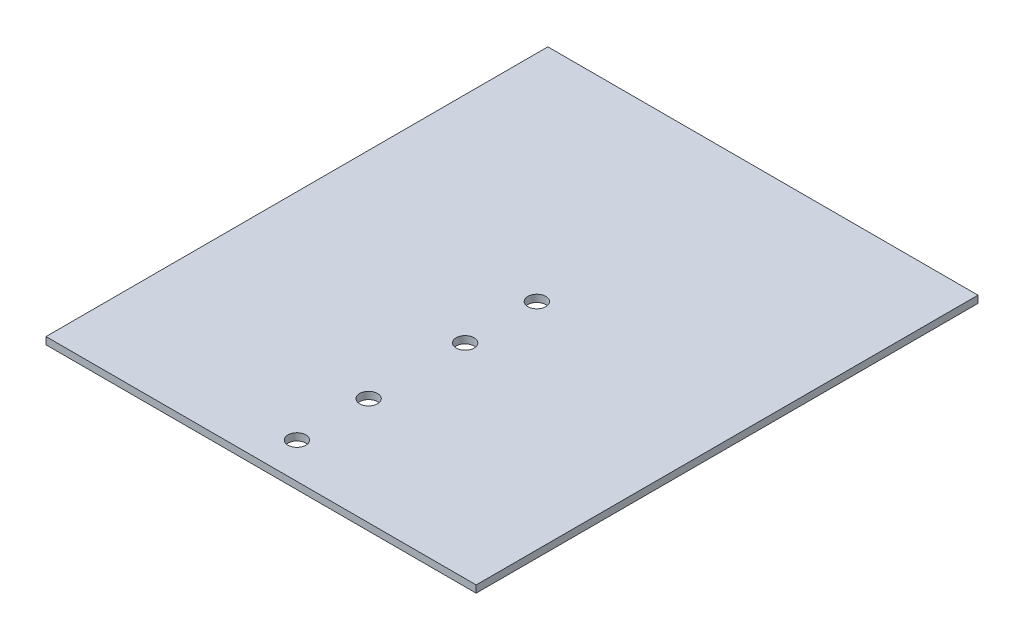
ISO-10303-21;
HEADER;
FILE_DESCRIPTION(('STEP AP214'),'2;1');
FILE_NAME('part.step','',(''),(''),'','','');
FILE_SCHEMA(('AUTOMOTIVE_DESIGN { 1 0 10303 214 1 1 1 1 }'));
ENDSEC;
DATA;
#1=APPLICATION_CONTEXT('core data for automotive mechanical design processes');
#2=APPLICATION_PROTOCOL_DEFINITION('international standard','automotive_design',2000,#1);
#3=PRODUCT_CONTEXT('',#1,'mechanical');
#4=PRODUCT('Part','Part','',(#3));
#5=PRODUCT_RELATED_PRODUCT_CATEGORY('part','',(#4));
#6=PRODUCT_DEFINITION_FORMATION('','',#4);
#7=PRODUCT_DEFINITION_CONTEXT('part definition',#1,'design');
#8=PRODUCT_DEFINITION('design','',#6,#7);
#9=PRODUCT_DEFINITION_SHAPE('','',#8);
#10=(LENGTH_UNIT() NAMED_UNIT(*) SI_UNIT(.MILLI.,.METRE.));
#11=(NAMED_UNIT(*) PLANE_ANGLE_UNIT() SI_UNIT($,.RADIAN.));
#12=(NAMED_UNIT(*) SI_UNIT($,.STERADIAN.) SOLID_ANGLE_UNIT());
#13=UNCERTAINTY_MEASURE_WITH_UNIT(LENGTH_MEASURE(1.E-05),#10,'distance_accuracy_value','');
#14=(GEOMETRIC_REPRESENTATION_CONTEXT(3) GLOBAL_UNCERTAINTY_ASSIGNED_CONTEXT((#13)) GLOBAL_UNIT_ASSIGNED_CONTEXT((#10,
#11,#12)) REPRESENTATION_CONTEXT('',''));
#15=CARTESIAN_POINT('',(0.,0.,0.));
#16=DIRECTION('',(0.,0.,1.));
#17=DIRECTION('',(1.,0.,0.));
#18=AXIS2_PLACEMENT_3D('',#15,#16,#17);
#19=CARTESIAN_POINT('',(76.2,2.54,88.9));
#20=DIRECTION('',(-1.,0.,0.));
#21=DIRECTION('',(0.,0.,1.));
#22=AXIS2_PLACEMENT_3D('',#19,#20,#21);
#23=PLANE('',#22);
#24=DIRECTION('',(0.,0.,-1.));
#25=VECTOR('',#24,1.);
#26=CARTESIAN_POINT('',(76.2,0.,88.9));
#27=LINE('',#26,#25);
#28=CARTESIAN_POINT('',(76.2,0.,88.9));
#29=VERTEX_POINT('',#28);
#30=CARTESIAN_POINT('',(76.2,0.,-88.9));
#31=VERTEX_POINT('',#30);
#32=EDGE_CURVE('E98',#29,#31,#27,.T.);
#33=ORIENTED_EDGE('',*,*,#32,.T.);
#34=DIRECTION('',(0.,-1.,0.));
#35=VECTOR('',#34,1.);
#36=CARTESIAN_POINT('',(76.2,2.54,-88.9));
#37=LINE('',#36,#35);
#38=CARTESIAN_POINT('',(76.2,2.54,-88.9));
#39=VERTEX_POINT('',#38);
#40=EDGE_CURVE('E11',#39,#31,#37,.T.);
#41=ORIENTED_EDGE('',*,*,#40,.F.);
#42=DIRECTION('',(0.,0.,-1.));
#43=VECTOR('',#42,1.);
#44=CARTESIAN_POINT('',(76.2,2.54,88.9));
#45=LINE('',#44,#43);
#46=CARTESIAN_POINT('',(76.2,2.54,88.9));
#47=VERTEX_POINT('',#46);
#48=EDGE_CURVE('E86',#47,#39,#45,.T.);
#49=ORIENTED_EDGE('',*,*,#48,.F.);
#50=DIRECTION('',(0.,-1.,0.));
#51=VECTOR('',#50,1.);
#52=CARTESIAN_POINT('',(76.2,2.54,88.9));
#53=LINE('',#52,#51);
#54=EDGE_CURVE('E94',#47,#29,#53,.T.);
#55=ORIENTED_EDGE('',*,*,#54,.T.);
#56=EDGE_LOOP('',(#33,#41,#49,#55));
#57=FACE_BOUND('',#56,.T.);
#58=ADVANCED_FACE('F35',(#57),#23,.F.);
#59=CARTESIAN_POINT('',(-76.2,2.54,-88.9));
#60=DIRECTION('',(0.,0.,1.));
#61=DIRECTION('',(1.,0.,0.));
#62=AXIS2_PLACEMENT_3D('',#59,#60,#61);
#63=PLANE('',#62);
#64=DIRECTION('',(-1.,0.,0.));
#65=VECTOR('',#64,1.);
#66=CARTESIAN_POINT('',(-76.2,0.,-88.9));
#67=LINE('',#66,#65);
#68=CARTESIAN_POINT('',(-76.2,0.,-88.9));
#69=VERTEX_POINT('',#68);
#70=EDGE_CURVE('E90',#31,#69,#67,.T.);
#71=ORIENTED_EDGE('',*,*,#70,.T.);
#72=DIRECTION('',(0.,-1.,0.));
#73=VECTOR('',#72,1.);
#74=CARTESIAN_POINT('',(-76.2,2.54,-88.9));
#75=LINE('',#74,#73);
#76=CARTESIAN_POINT('',(-76.2,2.54,-88.9));
#77=VERTEX_POINT('',#76);
#78=EDGE_CURVE('E43',#77,#69,#75,.T.);
#79=ORIENTED_EDGE('',*,*,#78,.F.);
#80=DIRECTION('',(-1.,0.,0.));
#81=VECTOR('',#80,1.);
#82=CARTESIAN_POINT('',(-76.2,2.54,-88.9));
#83=LINE('',#82,#81);
#84=EDGE_CURVE('E81',#39,#77,#83,.T.);
#85=ORIENTED_EDGE('',*,*,#84,.F.);
#86=ORIENTED_EDGE('',*,*,#40,.T.);
#87=EDGE_LOOP('',(#71,#79,#85,#86));
#88=FACE_BOUND('',#87,.T.);
#89=ADVANCED_FACE('F89',(#88),#63,.F.);
#90=CARTESIAN_POINT('',(-76.2,2.54,88.9));
#91=DIRECTION('',(1.,0.,0.));
#92=DIRECTION('',(0.,0.,-1.));
#93=AXIS2_PLACEMENT_3D('',#90,#91,#92);
#94=PLANE('',#93);
#95=DIRECTION('',(0.,0.,1.));
#96=VECTOR('',#95,1.);
#97=CARTESIAN_POINT('',(-76.2,0.,88.9));
#98=LINE('',#97,#96);
#99=CARTESIAN_POINT('',(-76.2,0.,88.9));
#100=VERTEX_POINT('',#99);
#101=EDGE_CURVE('E68',#69,#100,#98,.T.);
#102=ORIENTED_EDGE('',*,*,#101,.T.);
#103=DIRECTION('',(0.,-1.,0.));
#104=VECTOR('',#103,1.);
#105=CARTESIAN_POINT('',(-76.2,2.54,88.9));
#106=LINE('',#105,#104);
#107=CARTESIAN_POINT('',(-76.2,2.54,88.9));
#108=VERTEX_POINT('',#107);
#109=EDGE_CURVE('E91',#108,#100,#106,.T.);
#110=ORIENTED_EDGE('',*,*,#109,.F.);
#111=DIRECTION('',(0.,0.,1.));
#112=VECTOR('',#111,1.);
#113=CARTESIAN_POINT('',(-76.2,2.54,88.9));
#114=LINE('',#113,#112);
#115=EDGE_CURVE('E84',#77,#108,#114,.T.);
#116=ORIENTED_EDGE('',*,*,#115,.F.);
#117=ORIENTED_EDGE('',*,*,#78,.T.);
#118=EDGE_LOOP('',(#102,#110,#116,#117));
#119=FACE_BOUND('',#118,.T.);
#120=ADVANCED_FACE('F92',(#119),#94,.F.);
#121=CARTESIAN_POINT('',(-76.2,2.54,88.9));
#122=DIRECTION('',(0.,0.,-1.));
#123=DIRECTION('',(-1.,0.,0.));
#124=AXIS2_PLACEMENT_3D('',#121,#122,#123);
#125=PLANE('',#124);
#126=DIRECTION('',(1.,0.,0.));
#127=VECTOR('',#126,1.);
#128=CARTESIAN_POINT('',(-76.2,0.,88.9));
#129=LINE('',#128,#127);
#130=EDGE_CURVE('E74',#100,#29,#129,.T.);
#131=ORIENTED_EDGE('',*,*,#130,.T.);
#132=ORIENTED_EDGE('',*,*,#54,.F.);
#133=DIRECTION('',(1.,0.,0.));
#134=VECTOR('',#133,1.);
#135=CARTESIAN_POINT('',(-76.2,2.54,88.9));
#136=LINE('',#135,#134);
#137=EDGE_CURVE('E51',#108,#47,#136,.T.);
#138=ORIENTED_EDGE('',*,*,#137,.F.);
#139=ORIENTED_EDGE('',*,*,#109,.T.);
#140=EDGE_LOOP('',(#131,#132,#138,#139));
#141=FACE_BOUND('',#140,.T.);
#142=ADVANCED_FACE('F106',(#141),#125,.F.);
#143=CARTESIAN_POINT('',(0.,2.54,0.));
#144=DIRECTION('',(0.,-1.,0.));
#145=DIRECTION('',(0.,0.,-1.));
#146=AXIS2_PLACEMENT_3D('',#143,#144,#145);
#147=PLANE('',#146);
#148=CARTESIAN_POINT('',(-1.04083408558608E-13,2.54,76.2000000000001));
#149=DIRECTION('',(0.,-1.,0.));
#150=DIRECTION('',(0.,0.,-1.));
#151=AXIS2_PLACEMENT_3D('',#148,#149,#150);
#152=CIRCLE('',#151,3.17499999999999);
#153=CARTESIAN_POINT('',(-1.04083408558608E-13,2.54,73.0250000000001));
#154=VERTEX_POINT('',#153);
#155=EDGE_CURVE('E129',#154,#154,#152,.T.);
#156=ORIENTED_EDGE('',*,*,#155,.T.);
#157=EDGE_LOOP('',(#156));
#158=FACE_BOUND('',#157,.T.);
#159=CARTESIAN_POINT('',(-1.11022302462516E-13,2.54,50.8000000000001));
#160=DIRECTION('',(0.,-1.,0.));
#161=DIRECTION('',(0.,0.,-1.));
#162=AXIS2_PLACEMENT_3D('',#159,#160,#161);
#163=CIRCLE('',#162,3.17499999999999);
#164=CARTESIAN_POINT('',(-1.11022302462516E-13,2.54,47.6250000000001));
#165=VERTEX_POINT('',#164);
#166=EDGE_CURVE('E123',#165,#165,#163,.T.);
#167=ORIENTED_EDGE('',*,*,#166,.T.);
#168=EDGE_LOOP('',(#167));
#169=FACE_BOUND('',#168,.T.);
#170=CARTESIAN_POINT('',(-1.00440489259057E-12,2.54,-8.79918496487492));
#171=DIRECTION('',(0.,-1.,0.));
#172=DIRECTION('',(0.,0.,-1.));
#173=AXIS2_PLACEMENT_3D('',#170,#171,#172);
#174=CIRCLE('',#173,3.17499999999999);
#175=CARTESIAN_POINT('',(-1.00440489259057E-12,2.54,-11.9741849648749));
#176=VERTEX_POINT('',#175);
#177=EDGE_CURVE('E117',#176,#176,#174,.T.);
#178=ORIENTED_EDGE('',*,*,#177,.T.);
#179=EDGE_LOOP('',(#178));
#180=FACE_BOUND('',#179,.T.);
#181=CARTESIAN_POINT('',(-9.92261828258734E-13,2.54,16.6008150351251));
#182=DIRECTION('',(0.,-1.,0.));
#183=DIRECTION('',(0.,0.,-1.));
#184=AXIS2_PLACEMENT_3D('',#181,#182,#183);
#185=CIRCLE('',#184,3.17499999999999);
#186=CARTESIAN_POINT('',(-9.92261828258734E-13,2.54,13.4258150351251));
#187=VERTEX_POINT('',#186);
#188=EDGE_CURVE('E101',#187,#187,#185,.T.);
#189=ORIENTED_EDGE('',*,*,#188,.T.);
#190=EDGE_LOOP('',(#189));
#191=FACE_BOUND('',#190,.T.);
#192=ORIENTED_EDGE('',*,*,#48,.T.);
#193=ORIENTED_EDGE('',*,*,#84,.T.);
#194=ORIENTED_EDGE('',*,*,#115,.T.);
#195=ORIENTED_EDGE('',*,*,#137,.T.);
#196=EDGE_LOOP('',(#192,#193,#194,#195));
#197=FACE_BOUND('',#196,.T.);
#198=ADVANCED_FACE('F82',(#158,#169,#180,#191,#197),#147,.F.);
#199=CARTESIAN_POINT('',(0.,0.,0.));
#200=DIRECTION('',(0.,-1.,0.));
#201=DIRECTION('',(0.,0.,-1.));
#202=AXIS2_PLACEMENT_3D('',#199,#200,#201);
#203=PLANE('',#202);
#204=CARTESIAN_POINT('',(-1.04083408558608E-13,0.,76.2000000000001));
#205=DIRECTION('',(0.,-1.,0.));
#206=DIRECTION('',(0.,0.,-1.));
#207=AXIS2_PLACEMENT_3D('',#204,#205,#206);
#208=CIRCLE('',#207,3.17499999999999);
#209=CARTESIAN_POINT('',(-1.04083408558608E-13,0.,73.0250000000001));
#210=VERTEX_POINT('',#209);
#211=EDGE_CURVE('E132',#210,#210,#208,.T.);
#212=ORIENTED_EDGE('',*,*,#211,.F.);
#213=EDGE_LOOP('',(#212));
#214=FACE_BOUND('',#213,.T.);
#215=CARTESIAN_POINT('',(-1.11022302462516E-13,0.,50.8000000000001));
#216=DIRECTION('',(0.,-1.,0.));
#217=DIRECTION('',(0.,0.,-1.));
#218=AXIS2_PLACEMENT_3D('',#215,#216,#217);
#219=CIRCLE('',#218,3.17499999999999);
#220=CARTESIAN_POINT('',(-1.11022302462516E-13,0.,47.6250000000001));
#221=VERTEX_POINT('',#220);
#222=EDGE_CURVE('E126',#221,#221,#219,.T.);
#223=ORIENTED_EDGE('',*,*,#222,.F.);
#224=EDGE_LOOP('',(#223));
#225=FACE_BOUND('',#224,.T.);
#226=CARTESIAN_POINT('',(-1.00440489259057E-12,0.,-8.79918496487492));
#227=DIRECTION('',(0.,-1.,0.));
#228=DIRECTION('',(0.,0.,-1.));
#229=AXIS2_PLACEMENT_3D('',#226,#227,#228);
#230=CIRCLE('',#229,3.17499999999999);
#231=CARTESIAN_POINT('',(-1.00440489259057E-12,0.,-11.9741849648749));
#232=VERTEX_POINT('',#231);
#233=EDGE_CURVE('E120',#232,#232,#230,.T.);
#234=ORIENTED_EDGE('',*,*,#233,.F.);
#235=EDGE_LOOP('',(#234));
#236=FACE_BOUND('',#235,.T.);
#237=CARTESIAN_POINT('',(-9.92261828258734E-13,0.,16.6008150351251));
#238=DIRECTION('',(0.,-1.,0.));
#239=DIRECTION('',(0.,0.,-1.));
#240=AXIS2_PLACEMENT_3D('',#237,#238,#239);
#241=CIRCLE('',#240,3.17499999999999);
#242=CARTESIAN_POINT('',(-9.92261828258734E-13,0.,13.4258150351251));
#243=VERTEX_POINT('',#242);
#244=EDGE_CURVE('E114',#243,#243,#241,.T.);
#245=ORIENTED_EDGE('',*,*,#244,.F.);
#246=EDGE_LOOP('',(#245));
#247=FACE_BOUND('',#246,.T.);
#248=ORIENTED_EDGE('',*,*,#32,.F.);
#249=ORIENTED_EDGE('',*,*,#130,.F.);
#250=ORIENTED_EDGE('',*,*,#101,.F.);
#251=ORIENTED_EDGE('',*,*,#70,.F.);
#252=EDGE_LOOP('',(#248,#249,#250,#251));
#253=FACE_BOUND('',#252,.T.);
#254=ADVANCED_FACE('F109',(#214,#225,#236,#247,#253),#203,.T.);
#255=CARTESIAN_POINT('',(-9.92261828258734E-13,0.,16.6008150351251));
#256=DIRECTION('',(0.,-1.,0.));
#257=DIRECTION('',(0.,0.,-1.));
#258=AXIS2_PLACEMENT_3D('',#255,#256,#257);
#259=CYLINDRICAL_SURFACE('',#258,3.17499999999999);
#260=ORIENTED_EDGE('',*,*,#188,.F.);
#261=EDGE_LOOP('',(#260));
#262=FACE_BOUND('',#261,.T.);
#263=ORIENTED_EDGE('',*,*,#244,.T.);
#264=EDGE_LOOP('',(#263));
#265=FACE_BOUND('',#264,.T.);
#266=ADVANCED_FACE('F140',(#262,#265),#259,.F.);
#267=CARTESIAN_POINT('',(-1.00440489259057E-12,0.,-8.79918496487492));
#268=DIRECTION('',(0.,-1.,0.));
#269=DIRECTION('',(0.,0.,-1.));
#270=AXIS2_PLACEMENT_3D('',#267,#268,#269);
#271=CYLINDRICAL_SURFACE('',#270,3.17499999999999);
#272=ORIENTED_EDGE('',*,*,#177,.F.);
#273=EDGE_LOOP('',(#272));
#274=FACE_BOUND('',#273,.T.);
#275=ORIENTED_EDGE('',*,*,#233,.T.);
#276=EDGE_LOOP('',(#275));
#277=FACE_BOUND('',#276,.T.);
#278=ADVANCED_FACE('F149',(#274,#277),#271,.F.);
#279=CARTESIAN_POINT('',(-1.11022302462516E-13,0.,50.8000000000001));
#280=DIRECTION('',(0.,-1.,0.));
#281=DIRECTION('',(0.,0.,-1.));
#282=AXIS2_PLACEMENT_3D('',#279,#280,#281);
#283=CYLINDRICAL_SURFACE('',#282,3.17499999999999);
#284=ORIENTED_EDGE('',*,*,#166,.F.);
#285=EDGE_LOOP('',(#284));
#286=FACE_BOUND('',#285,.T.);
#287=ORIENTED_EDGE('',*,*,#222,.T.);
#288=EDGE_LOOP('',(#287));
#289=FACE_BOUND('',#288,.T.);
#290=ADVANCED_FACE('F156',(#286,#289),#283,.F.);
#291=CARTESIAN_POINT('',(-1.04083408558608E-13,0.,76.2000000000001));
#292=DIRECTION('',(0.,-1.,0.));
#293=DIRECTION('',(0.,0.,-1.));
#294=AXIS2_PLACEMENT_3D('',#291,#292,#293);
#295=CYLINDRICAL_SURFACE('',#294,3.17499999999999);
#296=ORIENTED_EDGE('',*,*,#155,.F.);
#297=EDGE_LOOP('',(#296));
#298=FACE_BOUND('',#297,.T.);
#299=ORIENTED_EDGE('',*,*,#211,.T.);
#300=EDGE_LOOP('',(#299));
#301=FACE_BOUND('',#300,.T.);
#302=ADVANCED_FACE('F136',(#298,#301),#295,.F.);
#303=CLOSED_SHELL('',(#58,#89,#120,#142,#198,#254,#266,#278,#290,#302));
#304=MANIFOLD_SOLID_BREP('B2',#303);
#305=ADVANCED_BREP_SHAPE_REPRESENTATION('',(#18,#304),#14);
#306=SHAPE_DEFINITION_REPRESENTATION(#9,#305);
ENDSEC;
END-ISO-10303-21;
